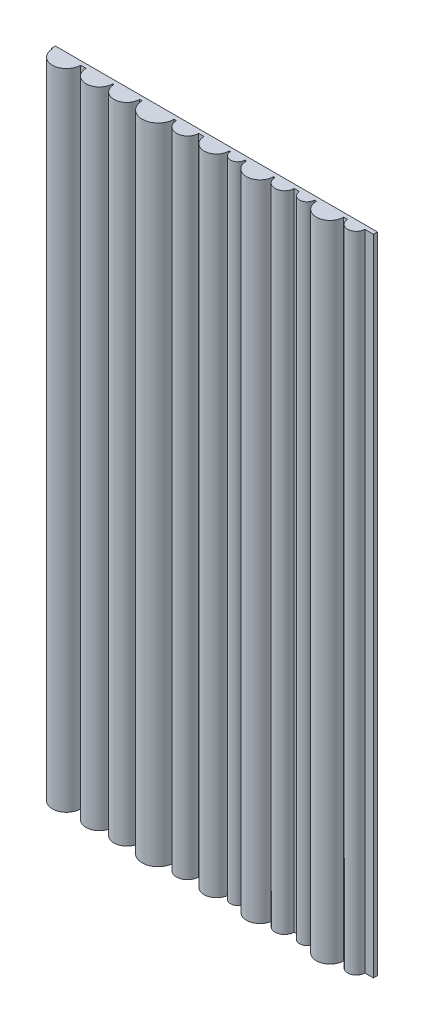
ISO-10303-21;
HEADER;
FILE_DESCRIPTION(('STEP AP214'),'2;1');
FILE_NAME('part.step','',(''),(''),'','','');
FILE_SCHEMA(('AUTOMOTIVE_DESIGN { 1 0 10303 214 1 1 1 1 }'));
ENDSEC;
DATA;
#1=APPLICATION_CONTEXT('core data for automotive mechanical design processes');
#2=APPLICATION_PROTOCOL_DEFINITION('international standard','automotive_design',2000,#1);
#3=PRODUCT_CONTEXT('',#1,'mechanical');
#4=PRODUCT('Part','Part','',(#3));
#5=PRODUCT_RELATED_PRODUCT_CATEGORY('part','',(#4));
#6=PRODUCT_DEFINITION_FORMATION('','',#4);
#7=PRODUCT_DEFINITION_CONTEXT('part definition',#1,'design');
#8=PRODUCT_DEFINITION('design','',#6,#7);
#9=PRODUCT_DEFINITION_SHAPE('','',#8);
#10=(LENGTH_UNIT() NAMED_UNIT(*) SI_UNIT(.MILLI.,.METRE.));
#11=(NAMED_UNIT(*) PLANE_ANGLE_UNIT() SI_UNIT($,.RADIAN.));
#12=(NAMED_UNIT(*) SI_UNIT($,.STERADIAN.) SOLID_ANGLE_UNIT());
#13=UNCERTAINTY_MEASURE_WITH_UNIT(LENGTH_MEASURE(1.E-05),#10,'distance_accuracy_value','');
#14=(GEOMETRIC_REPRESENTATION_CONTEXT(3) GLOBAL_UNCERTAINTY_ASSIGNED_CONTEXT((#13)) GLOBAL_UNIT_ASSIGNED_CONTEXT((#10,
#11,#12)) REPRESENTATION_CONTEXT('',''));
#15=CARTESIAN_POINT('',(0.,0.,0.));
#16=DIRECTION('',(0.,0.,1.));
#17=DIRECTION('',(1.,0.,0.));
#18=AXIS2_PLACEMENT_3D('',#15,#16,#17);
#19=CARTESIAN_POINT('',(0.,0.,0.1));
#20=DIRECTION('',(0.,0.,-1.));
#21=DIRECTION('',(-1.,0.,0.));
#22=AXIS2_PLACEMENT_3D('',#19,#20,#21);
#23=PLANE('',#22);
#24=DIRECTION('',(-1.,0.,0.));
#25=VECTOR('',#24,1.);
#26=CARTESIAN_POINT('',(0.,16.,0.1));
#27=LINE('',#26,#25);
#28=CARTESIAN_POINT('',(7.35997289214218,16.,0.1));
#29=VERTEX_POINT('',#28);
#30=CARTESIAN_POINT('',(7.26247222516436,16.,0.1));
#31=VERTEX_POINT('',#30);
#32=EDGE_CURVE('E233',#29,#31,#27,.T.);
#33=ORIENTED_EDGE('',*,*,#32,.T.);
#34=DIRECTION('',(0.,-1.,0.));
#35=VECTOR('',#34,1.);
#36=CARTESIAN_POINT('',(7.26247222516436,17.1228638474105,0.1));
#37=LINE('',#36,#35);
#38=CARTESIAN_POINT('',(7.26247222516436,0.,0.1));
#39=VERTEX_POINT('',#38);
#40=EDGE_CURVE('E54',#31,#39,#37,.T.);
#41=ORIENTED_EDGE('',*,*,#40,.T.);
#42=DIRECTION('',(1.,0.,0.));
#43=VECTOR('',#42,1.);
#44=CARTESIAN_POINT('',(0.,0.,0.1));
#45=LINE('',#44,#43);
#46=CARTESIAN_POINT('',(7.35997289214218,0.,0.1));
#47=VERTEX_POINT('',#46);
#48=EDGE_CURVE('E429',#39,#47,#45,.T.);
#49=ORIENTED_EDGE('',*,*,#48,.T.);
#50=DIRECTION('',(0.,-1.,0.));
#51=VECTOR('',#50,1.);
#52=CARTESIAN_POINT('',(7.35997289214218,17.1228638474105,0.1));
#53=LINE('',#52,#51);
#54=EDGE_CURVE('E292',#47,#29,#53,.F.);
#55=ORIENTED_EDGE('',*,*,#54,.T.);
#56=EDGE_LOOP('',(#33,#41,#49,#55));
#57=FACE_BOUND('',#56,.T.);
#58=ADVANCED_FACE('F38',(#57),#23,.F.);
#59=CARTESIAN_POINT('',(4.8464544478282,16.,0.1));
#60=VERTEX_POINT('',#59);
#61=CARTESIAN_POINT('',(4.80727128094524,16.,0.1));
#62=VERTEX_POINT('',#61);
#63=EDGE_CURVE('E492',#60,#62,#27,.T.);
#64=ORIENTED_EDGE('',*,*,#63,.T.);
#65=DIRECTION('',(0.,-1.,0.));
#66=VECTOR('',#65,1.);
#67=CARTESIAN_POINT('',(4.80727128094524,17.1228638474105,0.1));
#68=LINE('',#67,#66);
#69=CARTESIAN_POINT('',(4.80727128094524,0.,0.1));
#70=VERTEX_POINT('',#69);
#71=EDGE_CURVE('E266',#62,#70,#68,.T.);
#72=ORIENTED_EDGE('',*,*,#71,.T.);
#73=CARTESIAN_POINT('',(4.8464544478282,0.,0.1));
#74=VERTEX_POINT('',#73);
#75=EDGE_CURVE('E519',#70,#74,#45,.T.);
#76=ORIENTED_EDGE('',*,*,#75,.T.);
#77=DIRECTION('',(0.,-1.,0.));
#78=VECTOR('',#77,1.);
#79=CARTESIAN_POINT('',(4.8464544478282,17.1228638474105,0.1));
#80=LINE('',#79,#78);
#81=EDGE_CURVE('E335',#74,#60,#80,.F.);
#82=ORIENTED_EDGE('',*,*,#81,.T.);
#83=EDGE_LOOP('',(#64,#72,#76,#82));
#84=FACE_BOUND('',#83,.T.);
#85=ADVANCED_FACE('F560',(#84),#23,.F.);
#86=CARTESIAN_POINT('',(3.10842070374217,16.,0.1));
#87=VERTEX_POINT('',#86);
#88=CARTESIAN_POINT('',(3.04865491534628,16.,0.1));
#89=VERTEX_POINT('',#88);
#90=EDGE_CURVE('E483',#87,#89,#27,.T.);
#91=ORIENTED_EDGE('',*,*,#90,.T.);
#92=DIRECTION('',(0.,-1.,0.));
#93=VECTOR('',#92,1.);
#94=CARTESIAN_POINT('',(3.04865491534628,17.1228638474105,0.1));
#95=LINE('',#94,#93);
#96=CARTESIAN_POINT('',(3.04865491534628,0.,0.1));
#97=VERTEX_POINT('',#96);
#98=EDGE_CURVE('E281',#89,#97,#95,.T.);
#99=ORIENTED_EDGE('',*,*,#98,.T.);
#100=CARTESIAN_POINT('',(3.10842070374217,0.,0.1));
#101=VERTEX_POINT('',#100);
#102=EDGE_CURVE('E517',#97,#101,#45,.T.);
#103=ORIENTED_EDGE('',*,*,#102,.T.);
#104=DIRECTION('',(0.,-1.,0.));
#105=VECTOR('',#104,1.);
#106=CARTESIAN_POINT('',(3.10842070374217,17.1228638474105,0.1));
#107=LINE('',#106,#105);
#108=EDGE_CURVE('E365',#101,#87,#107,.F.);
#109=ORIENTED_EDGE('',*,*,#108,.T.);
#110=EDGE_LOOP('',(#91,#99,#103,#109));
#111=FACE_BOUND('',#110,.T.);
#112=ADVANCED_FACE('F565',(#111),#23,.F.);
#113=CARTESIAN_POINT('',(8.,16.,0.1));
#114=VERTEX_POINT('',#113);
#115=CARTESIAN_POINT('',(7.78590783886302,16.,0.1));
#116=VERTEX_POINT('',#115);
#117=EDGE_CURVE('E237',#114,#116,#27,.T.);
#118=ORIENTED_EDGE('',*,*,#117,.T.);
#119=DIRECTION('',(0.,-1.,0.));
#120=VECTOR('',#119,1.);
#121=CARTESIAN_POINT('',(7.78590783886302,17.1228638474105,0.1));
#122=LINE('',#121,#120);
#123=CARTESIAN_POINT('',(7.78590783886302,0.,0.1));
#124=VERTEX_POINT('',#123);
#125=EDGE_CURVE('E296',#116,#124,#122,.T.);
#126=ORIENTED_EDGE('',*,*,#125,.T.);
#127=CARTESIAN_POINT('',(8.,0.,0.1));
#128=VERTEX_POINT('',#127);
#129=EDGE_CURVE('E422',#124,#128,#45,.T.);
#130=ORIENTED_EDGE('',*,*,#129,.T.);
#131=DIRECTION('',(0.,1.,0.));
#132=VECTOR('',#131,1.);
#133=CARTESIAN_POINT('',(8.,0.,0.1));
#134=LINE('',#133,#132);
#135=EDGE_CURVE('E427',#128,#114,#134,.T.);
#136=ORIENTED_EDGE('',*,*,#135,.T.);
#137=EDGE_LOOP('',(#118,#126,#130,#136));
#138=FACE_BOUND('',#137,.T.);
#139=ADVANCED_FACE('F514',(#138),#23,.F.);
#140=CARTESIAN_POINT('',(6.52903295962137,0.,0.1));
#141=VERTEX_POINT('',#140);
#142=CARTESIAN_POINT('',(6.58191355824866,0.,0.1));
#143=VERTEX_POINT('',#142);
#144=EDGE_CURVE('E62',#141,#143,#45,.T.);
#145=ORIENTED_EDGE('',*,*,#144,.T.);
#146=DIRECTION('',(0.,-1.,0.));
#147=VECTOR('',#146,1.);
#148=CARTESIAN_POINT('',(6.58191355824866,17.1228638474105,0.1));
#149=LINE('',#148,#147);
#150=CARTESIAN_POINT('',(6.58191355824866,16.,0.1));
#151=VERTEX_POINT('',#150);
#152=EDGE_CURVE('E238',#143,#151,#149,.F.);
#153=ORIENTED_EDGE('',*,*,#152,.T.);
#154=CARTESIAN_POINT('',(6.52903295962137,16.,0.1));
#155=VERTEX_POINT('',#154);
#156=EDGE_CURVE('E225',#151,#155,#27,.T.);
#157=ORIENTED_EDGE('',*,*,#156,.T.);
#158=DIRECTION('',(0.,-1.,0.));
#159=VECTOR('',#158,1.);
#160=CARTESIAN_POINT('',(6.52903295962137,17.1228638474105,0.1));
#161=LINE('',#160,#159);
#162=EDGE_CURVE('E309',#155,#141,#161,.T.);
#163=ORIENTED_EDGE('',*,*,#162,.T.);
#164=EDGE_LOOP('',(#145,#153,#157,#163));
#165=FACE_BOUND('',#164,.T.);
#166=ADVANCED_FACE('F239',(#165),#23,.F.);
#167=CARTESIAN_POINT('',(6.03080442499624,0.,0.1));
#168=VERTEX_POINT('',#167);
#169=CARTESIAN_POINT('',(6.16298750561107,0.,0.1));
#170=VERTEX_POINT('',#169);
#171=EDGE_CURVE('E521',#168,#170,#45,.T.);
#172=ORIENTED_EDGE('',*,*,#171,.T.);
#173=DIRECTION('',(0.,-1.,0.));
#174=VECTOR('',#173,1.);
#175=CARTESIAN_POINT('',(6.16298750561107,17.1228638474105,0.1));
#176=LINE('',#175,#174);
#177=CARTESIAN_POINT('',(6.16298750561107,16.,0.1));
#178=VERTEX_POINT('',#177);
#179=EDGE_CURVE('E305',#170,#178,#176,.F.);
#180=ORIENTED_EDGE('',*,*,#179,.T.);
#181=CARTESIAN_POINT('',(6.03080442499624,16.,0.1));
#182=VERTEX_POINT('',#181);
#183=EDGE_CURVE('E234',#178,#182,#27,.T.);
#184=ORIENTED_EDGE('',*,*,#183,.T.);
#185=DIRECTION('',(0.,-1.,0.));
#186=VECTOR('',#185,1.);
#187=CARTESIAN_POINT('',(6.03080442499624,17.1228638474105,0.1));
#188=LINE('',#187,#186);
#189=EDGE_CURVE('E324',#182,#168,#188,.T.);
#190=ORIENTED_EDGE('',*,*,#189,.T.);
#191=EDGE_LOOP('',(#172,#180,#184,#190));
#192=FACE_BOUND('',#191,.T.);
#193=ADVANCED_FACE('F542',(#192),#23,.F.);
#194=CARTESIAN_POINT('',(5.52049952248696,0.,0.1));
#195=VERTEX_POINT('',#194);
#196=CARTESIAN_POINT('',(5.55630105868659,0.,0.1));
#197=VERTEX_POINT('',#196);
#198=EDGE_CURVE('E532',#195,#197,#45,.T.);
#199=ORIENTED_EDGE('',*,*,#198,.T.);
#200=DIRECTION('',(0.,-1.,0.));
#201=VECTOR('',#200,1.);
#202=CARTESIAN_POINT('',(5.55630105868659,17.1228638474105,0.1));
#203=LINE('',#202,#201);
#204=CARTESIAN_POINT('',(5.55630105868659,16.,0.1));
#205=VERTEX_POINT('',#204);
#206=EDGE_CURVE('E320',#197,#205,#203,.F.);
#207=ORIENTED_EDGE('',*,*,#206,.T.);
#208=CARTESIAN_POINT('',(5.52049952248696,16.,0.1));
#209=VERTEX_POINT('',#208);
#210=EDGE_CURVE('E497',#205,#209,#27,.T.);
#211=ORIENTED_EDGE('',*,*,#210,.T.);
#212=DIRECTION('',(0.,-1.,0.));
#213=VECTOR('',#212,1.);
#214=CARTESIAN_POINT('',(5.52049952248696,17.1228638474105,0.1));
#215=LINE('',#214,#213);
#216=EDGE_CURVE('E339',#209,#195,#215,.T.);
#217=ORIENTED_EDGE('',*,*,#216,.T.);
#218=EDGE_LOOP('',(#199,#207,#211,#217));
#219=FACE_BOUND('',#218,.T.);
#220=ADVANCED_FACE('F626',(#219),#23,.F.);
#221=CARTESIAN_POINT('',(4.41749297954344,0.,0.1));
#222=VERTEX_POINT('',#221);
#223=CARTESIAN_POINT('',(4.44798908830161,0.,0.1));
#224=VERTEX_POINT('',#223);
#225=EDGE_CURVE('E530',#222,#224,#45,.T.);
#226=ORIENTED_EDGE('',*,*,#225,.T.);
#227=DIRECTION('',(0.,-1.,0.));
#228=VECTOR('',#227,1.);
#229=CARTESIAN_POINT('',(4.44798908830161,17.1228638474105,0.1));
#230=LINE('',#229,#228);
#231=CARTESIAN_POINT('',(4.44798908830161,16.,0.1));
#232=VERTEX_POINT('',#231);
#233=EDGE_CURVE('E262',#224,#232,#230,.F.);
#234=ORIENTED_EDGE('',*,*,#233,.T.);
#235=CARTESIAN_POINT('',(4.41749297954344,16.,0.1));
#236=VERTEX_POINT('',#235);
#237=EDGE_CURVE('E236',#232,#236,#27,.T.);
#238=ORIENTED_EDGE('',*,*,#237,.T.);
#239=DIRECTION('',(0.,-1.,0.));
#240=VECTOR('',#239,1.);
#241=CARTESIAN_POINT('',(4.41749297954344,17.1228638474105,0.1));
#242=LINE('',#241,#240);
#243=EDGE_CURVE('E354',#236,#222,#242,.T.);
#244=ORIENTED_EDGE('',*,*,#243,.T.);
#245=EDGE_LOOP('',(#226,#234,#238,#244));
#246=FACE_BOUND('',#245,.T.);
#247=ADVANCED_FACE('F628',(#246),#23,.F.);
#248=CARTESIAN_POINT('',(3.65908630213837,0.,0.1));
#249=VERTEX_POINT('',#248);
#250=CARTESIAN_POINT('',(3.79385998382218,0.,0.1));
#251=VERTEX_POINT('',#250);
#252=EDGE_CURVE('E524',#249,#251,#45,.T.);
#253=ORIENTED_EDGE('',*,*,#252,.T.);
#254=DIRECTION('',(0.,-1.,0.));
#255=VECTOR('',#254,1.);
#256=CARTESIAN_POINT('',(3.79385998382218,17.1228638474105,0.1));
#257=LINE('',#256,#255);
#258=CARTESIAN_POINT('',(3.79385998382218,16.,0.1));
#259=VERTEX_POINT('',#258);
#260=EDGE_CURVE('E350',#251,#259,#257,.F.);
#261=ORIENTED_EDGE('',*,*,#260,.T.);
#262=CARTESIAN_POINT('',(3.65908630213837,16.,0.1));
#263=VERTEX_POINT('',#262);
#264=EDGE_CURVE('E488',#259,#263,#27,.T.);
#265=ORIENTED_EDGE('',*,*,#264,.T.);
#266=DIRECTION('',(0.,-1.,0.));
#267=VECTOR('',#266,1.);
#268=CARTESIAN_POINT('',(3.65908630213837,17.1228638474105,0.1));
#269=LINE('',#268,#267);
#270=EDGE_CURVE('E369',#263,#249,#269,.T.);
#271=ORIENTED_EDGE('',*,*,#270,.T.);
#272=EDGE_LOOP('',(#253,#261,#265,#271));
#273=FACE_BOUND('',#272,.T.);
#274=ADVANCED_FACE('F633',(#273),#23,.F.);
#275=CARTESIAN_POINT('',(2.19490448609716,0.,0.1));
#276=VERTEX_POINT('',#275);
#277=CARTESIAN_POINT('',(2.25467027449306,0.,0.1));
#278=VERTEX_POINT('',#277);
#279=EDGE_CURVE('E523',#276,#278,#45,.T.);
#280=ORIENTED_EDGE('',*,*,#279,.T.);
#281=DIRECTION('',(0.,-1.,0.));
#282=VECTOR('',#281,1.);
#283=CARTESIAN_POINT('',(2.25467027449306,17.1228638474105,0.1));
#284=LINE('',#283,#282);
#285=CARTESIAN_POINT('',(2.25467027449306,16.,0.1));
#286=VERTEX_POINT('',#285);
#287=EDGE_CURVE('E277',#278,#286,#284,.F.);
#288=ORIENTED_EDGE('',*,*,#287,.T.);
#289=CARTESIAN_POINT('',(2.19490448609716,16.,0.1));
#290=VERTEX_POINT('',#289);
#291=EDGE_CURVE('E482',#286,#290,#27,.T.);
#292=ORIENTED_EDGE('',*,*,#291,.T.);
#293=DIRECTION('',(0.,-1.,0.));
#294=VECTOR('',#293,1.);
#295=CARTESIAN_POINT('',(2.19490448609716,17.1228638474105,0.1));
#296=LINE('',#295,#294);
#297=EDGE_CURVE('E384',#290,#276,#296,.T.);
#298=ORIENTED_EDGE('',*,*,#297,.T.);
#299=EDGE_LOOP('',(#280,#288,#292,#298));
#300=FACE_BOUND('',#299,.T.);
#301=ADVANCED_FACE('F582',(#300),#23,.F.);
#302=CARTESIAN_POINT('',(1.52478365268645,0.,0.1));
#303=VERTEX_POINT('',#302);
#304=CARTESIAN_POINT('',(1.55480129349248,0.,0.1));
#305=VERTEX_POINT('',#304);
#306=EDGE_CURVE('E529',#303,#305,#45,.T.);
#307=ORIENTED_EDGE('',*,*,#306,.T.);
#308=DIRECTION('',(0.,-1.,0.));
#309=VECTOR('',#308,1.);
#310=CARTESIAN_POINT('',(1.55480129349248,17.1228638474105,0.1));
#311=LINE('',#310,#309);
#312=CARTESIAN_POINT('',(1.55480129349248,16.,0.1));
#313=VERTEX_POINT('',#312);
#314=EDGE_CURVE('E380',#305,#313,#311,.F.);
#315=ORIENTED_EDGE('',*,*,#314,.T.);
#316=CARTESIAN_POINT('',(1.52478365268645,16.,0.1));
#317=VERTEX_POINT('',#316);
#318=EDGE_CURVE('E478',#313,#317,#27,.T.);
#319=ORIENTED_EDGE('',*,*,#318,.T.);
#320=DIRECTION('',(0.,-1.,0.));
#321=VECTOR('',#320,1.);
#322=CARTESIAN_POINT('',(1.52478365268645,17.1228638474105,0.1));
#323=LINE('',#322,#321);
#324=EDGE_CURVE('E399',#317,#303,#323,.T.);
#325=ORIENTED_EDGE('',*,*,#324,.T.);
#326=EDGE_LOOP('',(#307,#315,#319,#325));
#327=FACE_BOUND('',#326,.T.);
#328=ADVANCED_FACE('F577',(#327),#23,.F.);
#329=CARTESIAN_POINT('',(0.726251270127603,0.,0.1));
#330=VERTEX_POINT('',#329);
#331=CARTESIAN_POINT('',(0.85988157762277,0.,0.1));
#332=VERTEX_POINT('',#331);
#333=EDGE_CURVE('E428',#330,#332,#45,.T.);
#334=ORIENTED_EDGE('',*,*,#333,.T.);
#335=DIRECTION('',(0.,-1.,0.));
#336=VECTOR('',#335,1.);
#337=CARTESIAN_POINT('',(0.85988157762277,17.1228638474105,0.1));
#338=LINE('',#337,#336);
#339=CARTESIAN_POINT('',(0.85988157762277,16.,0.1));
#340=VERTEX_POINT('',#339);
#341=EDGE_CURVE('E395',#332,#340,#338,.F.);
#342=ORIENTED_EDGE('',*,*,#341,.T.);
#343=CARTESIAN_POINT('',(0.726251270127603,16.,0.1));
#344=VERTEX_POINT('',#343);
#345=EDGE_CURVE('E476',#340,#344,#27,.T.);
#346=ORIENTED_EDGE('',*,*,#345,.T.);
#347=DIRECTION('',(0.,-1.,0.));
#348=VECTOR('',#347,1.);
#349=CARTESIAN_POINT('',(0.726251270127603,17.1228638474105,0.1));
#350=LINE('',#349,#348);
#351=EDGE_CURVE('E414',#344,#330,#350,.T.);
#352=ORIENTED_EDGE('',*,*,#351,.T.);
#353=EDGE_LOOP('',(#334,#342,#346,#352));
#354=FACE_BOUND('',#353,.T.);
#355=ADVANCED_FACE('F569',(#354),#23,.F.);
#356=CARTESIAN_POINT('',(0.,0.,0.1));
#357=DIRECTION('',(1.,0.,0.));
#358=DIRECTION('',(0.,0.,-1.));
#359=AXIS2_PLACEMENT_3D('',#356,#357,#358);
#360=PLANE('',#359);
#361=DIRECTION('',(0.,-1.,0.));
#362=VECTOR('',#361,1.);
#363=CARTESIAN_POINT('',(0.,0.,0.));
#364=LINE('',#363,#362);
#365=CARTESIAN_POINT('',(0.,16.,0.));
#366=VERTEX_POINT('',#365);
#367=CARTESIAN_POINT('',(0.,0.,0.));
#368=VERTEX_POINT('',#367);
#369=EDGE_CURVE('E417',#366,#368,#364,.T.);
#370=ORIENTED_EDGE('',*,*,#369,.T.);
#371=DIRECTION('',(0.,0.,-1.));
#372=VECTOR('',#371,1.);
#373=CARTESIAN_POINT('',(0.,0.,0.1));
#374=LINE('',#373,#372);
#375=CARTESIAN_POINT('',(0.,0.,0.1));
#376=VERTEX_POINT('',#375);
#377=EDGE_CURVE('E11',#376,#368,#374,.T.);
#378=ORIENTED_EDGE('',*,*,#377,.F.);
#379=DIRECTION('',(0.,-1.,0.));
#380=VECTOR('',#379,1.);
#381=CARTESIAN_POINT('',(0.,0.,0.1));
#382=LINE('',#381,#380);
#383=CARTESIAN_POINT('',(0.,16.,0.1));
#384=VERTEX_POINT('',#383);
#385=EDGE_CURVE('E418',#384,#376,#382,.T.);
#386=ORIENTED_EDGE('',*,*,#385,.F.);
#387=DIRECTION('',(0.,0.,-1.));
#388=VECTOR('',#387,1.);
#389=CARTESIAN_POINT('',(0.,16.,0.1));
#390=LINE('',#389,#388);
#391=EDGE_CURVE('E434',#384,#366,#390,.T.);
#392=ORIENTED_EDGE('',*,*,#391,.T.);
#393=EDGE_LOOP('',(#370,#378,#386,#392));
#394=FACE_BOUND('',#393,.T.);
#395=ADVANCED_FACE('F40',(#394),#360,.F.);
#396=CARTESIAN_POINT('',(0.,0.,0.1));
#397=DIRECTION('',(0.,1.,0.));
#398=DIRECTION('',(0.,0.,1.));
#399=AXIS2_PLACEMENT_3D('',#396,#397,#398);
#400=PLANE('',#399);
#401=DIRECTION('',(1.,0.,0.));
#402=VECTOR('',#401,1.);
#403=CARTESIAN_POINT('',(0.,0.,0.));
#404=LINE('',#403,#402);
#405=CARTESIAN_POINT('',(8.,0.,0.));
#406=VERTEX_POINT('',#405);
#407=EDGE_CURVE('E438',#368,#406,#404,.T.);
#408=ORIENTED_EDGE('',*,*,#407,.T.);
#409=DIRECTION('',(0.,0.,-1.));
#410=VECTOR('',#409,1.);
#411=CARTESIAN_POINT('',(8.,0.,0.1));
#412=LINE('',#411,#410);
#413=EDGE_CURVE('E47',#128,#406,#412,.T.);
#414=ORIENTED_EDGE('',*,*,#413,.F.);
#415=ORIENTED_EDGE('',*,*,#129,.F.);
#416=CARTESIAN_POINT('',(7.5729403655026,0.,0.1));
#417=DIRECTION('',(0.,-1.,0.));
#418=DIRECTION('',(0.,0.,-1.));
#419=AXIS2_PLACEMENT_3D('',#416,#417,#418);
#420=CIRCLE('',#419,0.212967473360418);
#421=EDGE_CURVE('E284',#124,#47,#420,.T.);
#422=ORIENTED_EDGE('',*,*,#421,.T.);
#423=ORIENTED_EDGE('',*,*,#48,.F.);
#424=CARTESIAN_POINT('',(6.92219289170651,0.,0.1));
#425=DIRECTION('',(0.,-1.,0.));
#426=DIRECTION('',(0.,0.,-1.));
#427=AXIS2_PLACEMENT_3D('',#424,#425,#426);
#428=CIRCLE('',#427,0.340279333457847);
#429=EDGE_CURVE('E247',#39,#143,#428,.T.);
#430=ORIENTED_EDGE('',*,*,#429,.T.);
#431=ORIENTED_EDGE('',*,*,#144,.F.);
#432=CARTESIAN_POINT('',(6.34601023261622,0.,0.1));
#433=DIRECTION('',(0.,-1.,0.));
#434=DIRECTION('',(0.,0.,-1.));
#435=AXIS2_PLACEMENT_3D('',#432,#433,#434);
#436=CIRCLE('',#435,0.18302272700515);
#437=EDGE_CURVE('E299',#141,#170,#436,.T.);
#438=ORIENTED_EDGE('',*,*,#437,.T.);
#439=ORIENTED_EDGE('',*,*,#171,.F.);
#440=CARTESIAN_POINT('',(5.79355274184142,0.,0.1));
#441=DIRECTION('',(0.,-1.,0.));
#442=DIRECTION('',(0.,0.,-1.));
#443=AXIS2_PLACEMENT_3D('',#440,#441,#442);
#444=CIRCLE('',#443,0.237251683154824);
#445=EDGE_CURVE('E312',#168,#197,#444,.T.);
#446=ORIENTED_EDGE('',*,*,#445,.T.);
#447=ORIENTED_EDGE('',*,*,#198,.F.);
#448=CARTESIAN_POINT('',(5.18347698515758,0.,0.1));
#449=DIRECTION('',(0.,-1.,0.));
#450=DIRECTION('',(0.,0.,-1.));
#451=AXIS2_PLACEMENT_3D('',#448,#449,#450);
#452=CIRCLE('',#451,0.337022537329384);
#453=EDGE_CURVE('E327',#195,#74,#452,.T.);
#454=ORIENTED_EDGE('',*,*,#453,.T.);
#455=ORIENTED_EDGE('',*,*,#75,.F.);
#456=CARTESIAN_POINT('',(4.62763018462342,0.,0.1));
#457=DIRECTION('',(0.,-1.,0.));
#458=DIRECTION('',(0.,0.,-1.));
#459=AXIS2_PLACEMENT_3D('',#456,#457,#458);
#460=CIRCLE('',#459,0.179641096321815);
#461=EDGE_CURVE('E254',#70,#224,#460,.T.);
#462=ORIENTED_EDGE('',*,*,#461,.T.);
#463=ORIENTED_EDGE('',*,*,#225,.F.);
#464=CARTESIAN_POINT('',(4.10567648168281,0.,0.1));
#465=DIRECTION('',(0.,-1.,0.));
#466=DIRECTION('',(0.,0.,-1.));
#467=AXIS2_PLACEMENT_3D('',#464,#465,#466);
#468=CIRCLE('',#467,0.311816497860627);
#469=EDGE_CURVE('E342',#222,#251,#468,.T.);
#470=ORIENTED_EDGE('',*,*,#469,.T.);
#471=ORIENTED_EDGE('',*,*,#252,.F.);
#472=CARTESIAN_POINT('',(3.38375350294027,0.,0.1));
#473=DIRECTION('',(0.,-1.,0.));
#474=DIRECTION('',(0.,0.,-1.));
#475=AXIS2_PLACEMENT_3D('',#472,#473,#474);
#476=CIRCLE('',#475,0.275332799198097);
#477=EDGE_CURVE('E357',#249,#101,#476,.T.);
#478=ORIENTED_EDGE('',*,*,#477,.T.);
#479=ORIENTED_EDGE('',*,*,#102,.F.);
#480=CARTESIAN_POINT('',(2.65166259491967,0.,0.1));
#481=DIRECTION('',(0.,-1.,0.));
#482=DIRECTION('',(0.,0.,-1.));
#483=AXIS2_PLACEMENT_3D('',#480,#481,#482);
#484=CIRCLE('',#483,0.396992320426608);
#485=EDGE_CURVE('E269',#97,#278,#484,.T.);
#486=ORIENTED_EDGE('',*,*,#485,.T.);
#487=ORIENTED_EDGE('',*,*,#279,.F.);
#488=CARTESIAN_POINT('',(1.87485288979482,0.,0.1));
#489=DIRECTION('',(0.,-1.,0.));
#490=DIRECTION('',(0.,0.,-1.));
#491=AXIS2_PLACEMENT_3D('',#488,#489,#490);
#492=CIRCLE('',#491,0.320051596302342);
#493=EDGE_CURVE('E372',#276,#305,#492,.T.);
#494=ORIENTED_EDGE('',*,*,#493,.T.);
#495=ORIENTED_EDGE('',*,*,#306,.F.);
#496=CARTESIAN_POINT('',(1.19233261515461,0.,0.1));
#497=DIRECTION('',(0.,-1.,0.));
#498=DIRECTION('',(0.,0.,-1.));
#499=AXIS2_PLACEMENT_3D('',#496,#497,#498);
#500=CIRCLE('',#499,0.332451037531842);
#501=EDGE_CURVE('E387',#303,#332,#500,.T.);
#502=ORIENTED_EDGE('',*,*,#501,.T.);
#503=ORIENTED_EDGE('',*,*,#333,.F.);
#504=CARTESIAN_POINT('',(0.375106214878597,0.,0.1));
#505=DIRECTION('',(0.,-1.,0.));
#506=DIRECTION('',(0.,0.,-1.));
#507=AXIS2_PLACEMENT_3D('',#504,#505,#506);
#508=CIRCLE('',#507,0.351145055249006);
#509=CARTESIAN_POINT('',(0.0239611596295905,0.,0.1));
#510=VERTEX_POINT('',#509);
#511=EDGE_CURVE('E402',#330,#510,#508,.T.);
#512=ORIENTED_EDGE('',*,*,#511,.T.);
#513=EDGE_CURVE('E424',#376,#510,#45,.T.);
#514=ORIENTED_EDGE('',*,*,#513,.F.);
#515=ORIENTED_EDGE('',*,*,#377,.T.);
#516=EDGE_LOOP('',(#408,#414,#415,#422,#423,#430,#431,#438,#439,#446,#447,#454,#455,#462,#463,
#470,#471,#478,#479,#486,#487,#494,#495,#502,#503,#512,#514,#515));
#517=FACE_BOUND('',#516,.T.);
#518=ADVANCED_FACE('F515',(#517),#400,.F.);
#519=CARTESIAN_POINT('',(8.,0.,0.1));
#520=DIRECTION('',(-1.,0.,0.));
#521=DIRECTION('',(0.,0.,1.));
#522=AXIS2_PLACEMENT_3D('',#519,#520,#521);
#523=PLANE('',#522);
#524=DIRECTION('',(0.,1.,0.));
#525=VECTOR('',#524,1.);
#526=CARTESIAN_POINT('',(8.,0.,0.));
#527=LINE('',#526,#525);
#528=CARTESIAN_POINT('',(8.,16.,0.));
#529=VERTEX_POINT('',#528);
#530=EDGE_CURVE('E441',#406,#529,#527,.T.);
#531=ORIENTED_EDGE('',*,*,#530,.T.);
#532=DIRECTION('',(0.,0.,-1.));
#533=VECTOR('',#532,1.);
#534=CARTESIAN_POINT('',(8.,16.,0.1));
#535=LINE('',#534,#533);
#536=EDGE_CURVE('E449',#114,#529,#535,.T.);
#537=ORIENTED_EDGE('',*,*,#536,.F.);
#538=ORIENTED_EDGE('',*,*,#135,.F.);
#539=ORIENTED_EDGE('',*,*,#413,.T.);
#540=EDGE_LOOP('',(#531,#537,#538,#539));
#541=FACE_BOUND('',#540,.T.);
#542=ADVANCED_FACE('F458',(#541),#523,.F.);
#543=CARTESIAN_POINT('',(0.,16.,0.1));
#544=DIRECTION('',(0.,-1.,0.));
#545=DIRECTION('',(0.,0.,-1.));
#546=AXIS2_PLACEMENT_3D('',#543,#544,#545);
#547=PLANE('',#546);
#548=DIRECTION('',(-1.,0.,0.));
#549=VECTOR('',#548,1.);
#550=CARTESIAN_POINT('',(0.,16.,0.));
#551=LINE('',#550,#549);
#552=EDGE_CURVE('E423',#529,#366,#551,.T.);
#553=ORIENTED_EDGE('',*,*,#552,.T.);
#554=ORIENTED_EDGE('',*,*,#391,.F.);
#555=CARTESIAN_POINT('',(0.0239611596295905,16.,0.1));
#556=VERTEX_POINT('',#555);
#557=EDGE_CURVE('E431',#556,#384,#27,.T.);
#558=ORIENTED_EDGE('',*,*,#557,.F.);
#559=CARTESIAN_POINT('',(0.375106214878597,16.,0.1));
#560=DIRECTION('',(0.,-1.,0.));
#561=DIRECTION('',(0.,0.,-1.));
#562=AXIS2_PLACEMENT_3D('',#559,#560,#561);
#563=CIRCLE('',#562,0.351145055249006);
#564=EDGE_CURVE('E406',#556,#344,#563,.F.);
#565=ORIENTED_EDGE('',*,*,#564,.T.);
#566=ORIENTED_EDGE('',*,*,#345,.F.);
#567=CARTESIAN_POINT('',(1.19233261515461,16.,0.1));
#568=DIRECTION('',(0.,-1.,0.));
#569=DIRECTION('',(0.,0.,-1.));
#570=AXIS2_PLACEMENT_3D('',#567,#568,#569);
#571=CIRCLE('',#570,0.332451037531842);
#572=EDGE_CURVE('E391',#340,#317,#571,.F.);
#573=ORIENTED_EDGE('',*,*,#572,.T.);
#574=ORIENTED_EDGE('',*,*,#318,.F.);
#575=CARTESIAN_POINT('',(1.87485288979482,16.,0.1));
#576=DIRECTION('',(0.,-1.,0.));
#577=DIRECTION('',(0.,0.,-1.));
#578=AXIS2_PLACEMENT_3D('',#575,#576,#577);
#579=CIRCLE('',#578,0.320051596302342);
#580=EDGE_CURVE('E376',#313,#290,#579,.F.);
#581=ORIENTED_EDGE('',*,*,#580,.T.);
#582=ORIENTED_EDGE('',*,*,#291,.F.);
#583=CARTESIAN_POINT('',(2.65166259491967,16.,0.1));
#584=DIRECTION('',(0.,-1.,0.));
#585=DIRECTION('',(0.,0.,-1.));
#586=AXIS2_PLACEMENT_3D('',#583,#584,#585);
#587=CIRCLE('',#586,0.396992320426608);
#588=EDGE_CURVE('E273',#286,#89,#587,.F.);
#589=ORIENTED_EDGE('',*,*,#588,.T.);
#590=ORIENTED_EDGE('',*,*,#90,.F.);
#591=CARTESIAN_POINT('',(3.38375350294027,16.,0.1));
#592=DIRECTION('',(0.,-1.,0.));
#593=DIRECTION('',(0.,0.,-1.));
#594=AXIS2_PLACEMENT_3D('',#591,#592,#593);
#595=CIRCLE('',#594,0.275332799198097);
#596=EDGE_CURVE('E361',#87,#263,#595,.F.);
#597=ORIENTED_EDGE('',*,*,#596,.T.);
#598=ORIENTED_EDGE('',*,*,#264,.F.);
#599=CARTESIAN_POINT('',(4.10567648168281,16.,0.1));
#600=DIRECTION('',(0.,-1.,0.));
#601=DIRECTION('',(0.,0.,-1.));
#602=AXIS2_PLACEMENT_3D('',#599,#600,#601);
#603=CIRCLE('',#602,0.311816497860627);
#604=EDGE_CURVE('E346',#259,#236,#603,.F.);
#605=ORIENTED_EDGE('',*,*,#604,.T.);
#606=ORIENTED_EDGE('',*,*,#237,.F.);
#607=CARTESIAN_POINT('',(4.62763018462342,16.,0.1));
#608=DIRECTION('',(0.,-1.,0.));
#609=DIRECTION('',(0.,0.,-1.));
#610=AXIS2_PLACEMENT_3D('',#607,#608,#609);
#611=CIRCLE('',#610,0.179641096321815);
#612=EDGE_CURVE('E258',#232,#62,#611,.F.);
#613=ORIENTED_EDGE('',*,*,#612,.T.);
#614=ORIENTED_EDGE('',*,*,#63,.F.);
#615=CARTESIAN_POINT('',(5.18347698515758,16.,0.1));
#616=DIRECTION('',(0.,-1.,0.));
#617=DIRECTION('',(0.,0.,-1.));
#618=AXIS2_PLACEMENT_3D('',#615,#616,#617);
#619=CIRCLE('',#618,0.337022537329384);
#620=EDGE_CURVE('E331',#60,#209,#619,.F.);
#621=ORIENTED_EDGE('',*,*,#620,.T.);
#622=ORIENTED_EDGE('',*,*,#210,.F.);
#623=CARTESIAN_POINT('',(5.79355274184142,16.,0.1));
#624=DIRECTION('',(0.,-1.,0.));
#625=DIRECTION('',(0.,0.,-1.));
#626=AXIS2_PLACEMENT_3D('',#623,#624,#625);
#627=CIRCLE('',#626,0.237251683154824);
#628=EDGE_CURVE('E316',#205,#182,#627,.F.);
#629=ORIENTED_EDGE('',*,*,#628,.T.);
#630=ORIENTED_EDGE('',*,*,#183,.F.);
#631=CARTESIAN_POINT('',(6.34601023261622,16.,0.1));
#632=DIRECTION('',(0.,-1.,0.));
#633=DIRECTION('',(0.,0.,-1.));
#634=AXIS2_PLACEMENT_3D('',#631,#632,#633);
#635=CIRCLE('',#634,0.18302272700515);
#636=EDGE_CURVE('E230',#178,#155,#635,.F.);
#637=ORIENTED_EDGE('',*,*,#636,.T.);
#638=ORIENTED_EDGE('',*,*,#156,.F.);
#639=CARTESIAN_POINT('',(6.92219289170651,16.,0.1));
#640=DIRECTION('',(0.,-1.,0.));
#641=DIRECTION('',(0.,0.,-1.));
#642=AXIS2_PLACEMENT_3D('',#639,#640,#641);
#643=CIRCLE('',#642,0.340279333457847);
#644=EDGE_CURVE('E228',#151,#31,#643,.F.);
#645=ORIENTED_EDGE('',*,*,#644,.T.);
#646=ORIENTED_EDGE('',*,*,#32,.F.);
#647=CARTESIAN_POINT('',(7.5729403655026,16.,0.1));
#648=DIRECTION('',(0.,-1.,0.));
#649=DIRECTION('',(0.,0.,-1.));
#650=AXIS2_PLACEMENT_3D('',#647,#648,#649);
#651=CIRCLE('',#650,0.212967473360418);
#652=EDGE_CURVE('E288',#29,#116,#651,.F.);
#653=ORIENTED_EDGE('',*,*,#652,.T.);
#654=ORIENTED_EDGE('',*,*,#117,.F.);
#655=ORIENTED_EDGE('',*,*,#536,.T.);
#656=EDGE_LOOP('',(#553,#554,#558,#565,#566,#573,#574,#581,#582,#589,#590,#597,#598,#605,#606,
#613,#614,#621,#622,#629,#630,#637,#638,#645,#646,#653,#654,#655));
#657=FACE_BOUND('',#656,.T.);
#658=ADVANCED_FACE('F226',(#657),#547,.F.);
#659=ORIENTED_EDGE('',*,*,#513,.T.);
#660=DIRECTION('',(0.,-1.,0.));
#661=VECTOR('',#660,1.);
#662=CARTESIAN_POINT('',(0.0239611596295905,17.1228638474105,0.1));
#663=LINE('',#662,#661);
#664=EDGE_CURVE('E410',#510,#556,#663,.F.);
#665=ORIENTED_EDGE('',*,*,#664,.T.);
#666=ORIENTED_EDGE('',*,*,#557,.T.);
#667=ORIENTED_EDGE('',*,*,#385,.T.);
#668=EDGE_LOOP('',(#659,#665,#666,#667));
#669=FACE_BOUND('',#668,.T.);
#670=ADVANCED_FACE('F472',(#669),#23,.F.);
#671=CARTESIAN_POINT('',(0.,0.,0.));
#672=DIRECTION('',(0.,0.,-1.));
#673=DIRECTION('',(-1.,0.,0.));
#674=AXIS2_PLACEMENT_3D('',#671,#672,#673);
#675=PLANE('',#674);
#676=ORIENTED_EDGE('',*,*,#369,.F.);
#677=ORIENTED_EDGE('',*,*,#552,.F.);
#678=ORIENTED_EDGE('',*,*,#530,.F.);
#679=ORIENTED_EDGE('',*,*,#407,.F.);
#680=EDGE_LOOP('',(#676,#677,#678,#679));
#681=FACE_BOUND('',#680,.T.);
#682=ADVANCED_FACE('F465',(#681),#675,.T.);
#683=CARTESIAN_POINT('',(0.375106214878597,17.1228638474105,0.1));
#684=DIRECTION('',(0.,-1.,0.));
#685=DIRECTION('',(0.,0.,-1.));
#686=AXIS2_PLACEMENT_3D('',#683,#684,#685);
#687=CYLINDRICAL_SURFACE('',#686,0.351145055249006);
#688=ORIENTED_EDGE('',*,*,#351,.F.);
#689=ORIENTED_EDGE('',*,*,#564,.F.);
#690=ORIENTED_EDGE('',*,*,#664,.F.);
#691=ORIENTED_EDGE('',*,*,#511,.F.);
#692=EDGE_LOOP('',(#688,#689,#690,#691));
#693=FACE_BOUND('',#692,.T.);
#694=ADVANCED_FACE('F574',(#693),#687,.T.);
#695=CARTESIAN_POINT('',(1.19233261515461,17.1228638474105,0.1));
#696=DIRECTION('',(0.,-1.,0.));
#697=DIRECTION('',(0.,0.,-1.));
#698=AXIS2_PLACEMENT_3D('',#695,#696,#697);
#699=CYLINDRICAL_SURFACE('',#698,0.332451037531842);
#700=ORIENTED_EDGE('',*,*,#324,.F.);
#701=ORIENTED_EDGE('',*,*,#572,.F.);
#702=ORIENTED_EDGE('',*,*,#341,.F.);
#703=ORIENTED_EDGE('',*,*,#501,.F.);
#704=EDGE_LOOP('',(#700,#701,#702,#703));
#705=FACE_BOUND('',#704,.T.);
#706=ADVANCED_FACE('F590',(#705),#699,.T.);
#707=CARTESIAN_POINT('',(1.87485288979482,17.1228638474105,0.1));
#708=DIRECTION('',(0.,-1.,0.));
#709=DIRECTION('',(0.,0.,-1.));
#710=AXIS2_PLACEMENT_3D('',#707,#708,#709);
#711=CYLINDRICAL_SURFACE('',#710,0.320051596302342);
#712=ORIENTED_EDGE('',*,*,#297,.F.);
#713=ORIENTED_EDGE('',*,*,#580,.F.);
#714=ORIENTED_EDGE('',*,*,#314,.F.);
#715=ORIENTED_EDGE('',*,*,#493,.F.);
#716=EDGE_LOOP('',(#712,#713,#714,#715));
#717=FACE_BOUND('',#716,.T.);
#718=ADVANCED_FACE('F599',(#717),#711,.T.);
#719=CARTESIAN_POINT('',(3.38375350294027,17.1228638474105,0.1));
#720=DIRECTION('',(0.,-1.,0.));
#721=DIRECTION('',(0.,0.,-1.));
#722=AXIS2_PLACEMENT_3D('',#719,#720,#721);
#723=CYLINDRICAL_SURFACE('',#722,0.275332799198097);
#724=ORIENTED_EDGE('',*,*,#270,.F.);
#725=ORIENTED_EDGE('',*,*,#596,.F.);
#726=ORIENTED_EDGE('',*,*,#108,.F.);
#727=ORIENTED_EDGE('',*,*,#477,.F.);
#728=EDGE_LOOP('',(#724,#725,#726,#727));
#729=FACE_BOUND('',#728,.T.);
#730=ADVANCED_FACE('F609',(#729),#723,.T.);
#731=CARTESIAN_POINT('',(4.10567648168281,17.1228638474105,0.1));
#732=DIRECTION('',(0.,-1.,0.));
#733=DIRECTION('',(0.,0.,-1.));
#734=AXIS2_PLACEMENT_3D('',#731,#732,#733);
#735=CYLINDRICAL_SURFACE('',#734,0.311816497860627);
#736=ORIENTED_EDGE('',*,*,#243,.F.);
#737=ORIENTED_EDGE('',*,*,#604,.F.);
#738=ORIENTED_EDGE('',*,*,#260,.F.);
#739=ORIENTED_EDGE('',*,*,#469,.F.);
#740=EDGE_LOOP('',(#736,#737,#738,#739));
#741=FACE_BOUND('',#740,.T.);
#742=ADVANCED_FACE('F612',(#741),#735,.T.);
#743=CARTESIAN_POINT('',(5.18347698515758,17.1228638474105,0.1));
#744=DIRECTION('',(0.,-1.,0.));
#745=DIRECTION('',(0.,0.,-1.));
#746=AXIS2_PLACEMENT_3D('',#743,#744,#745);
#747=CYLINDRICAL_SURFACE('',#746,0.337022537329384);
#748=ORIENTED_EDGE('',*,*,#216,.F.);
#749=ORIENTED_EDGE('',*,*,#620,.F.);
#750=ORIENTED_EDGE('',*,*,#81,.F.);
#751=ORIENTED_EDGE('',*,*,#453,.F.);
#752=EDGE_LOOP('',(#748,#749,#750,#751));
#753=FACE_BOUND('',#752,.T.);
#754=ADVANCED_FACE('F556',(#753),#747,.T.);
#755=CARTESIAN_POINT('',(5.79355274184142,17.1228638474105,0.1));
#756=DIRECTION('',(0.,-1.,0.));
#757=DIRECTION('',(0.,0.,-1.));
#758=AXIS2_PLACEMENT_3D('',#755,#756,#757);
#759=CYLINDRICAL_SURFACE('',#758,0.237251683154824);
#760=ORIENTED_EDGE('',*,*,#189,.F.);
#761=ORIENTED_EDGE('',*,*,#628,.F.);
#762=ORIENTED_EDGE('',*,*,#206,.F.);
#763=ORIENTED_EDGE('',*,*,#445,.F.);
#764=EDGE_LOOP('',(#760,#761,#762,#763));
#765=FACE_BOUND('',#764,.T.);
#766=ADVANCED_FACE('F548',(#765),#759,.T.);
#767=CARTESIAN_POINT('',(6.34601023261622,17.1228638474105,0.1));
#768=DIRECTION('',(0.,-1.,0.));
#769=DIRECTION('',(0.,0.,-1.));
#770=AXIS2_PLACEMENT_3D('',#767,#768,#769);
#771=CYLINDRICAL_SURFACE('',#770,0.18302272700515);
#772=ORIENTED_EDGE('',*,*,#162,.F.);
#773=ORIENTED_EDGE('',*,*,#636,.F.);
#774=ORIENTED_EDGE('',*,*,#179,.F.);
#775=ORIENTED_EDGE('',*,*,#437,.F.);
#776=EDGE_LOOP('',(#772,#773,#774,#775));
#777=FACE_BOUND('',#776,.T.);
#778=ADVANCED_FACE('F546',(#777),#771,.T.);
#779=CARTESIAN_POINT('',(7.5729403655026,17.1228638474105,0.1));
#780=DIRECTION('',(0.,-1.,0.));
#781=DIRECTION('',(0.,0.,-1.));
#782=AXIS2_PLACEMENT_3D('',#779,#780,#781);
#783=CYLINDRICAL_SURFACE('',#782,0.212967473360418);
#784=ORIENTED_EDGE('',*,*,#125,.F.);
#785=ORIENTED_EDGE('',*,*,#652,.F.);
#786=ORIENTED_EDGE('',*,*,#54,.F.);
#787=ORIENTED_EDGE('',*,*,#421,.F.);
#788=EDGE_LOOP('',(#784,#785,#786,#787));
#789=FACE_BOUND('',#788,.T.);
#790=ADVANCED_FACE('F511',(#789),#783,.T.);
#791=CARTESIAN_POINT('',(2.65166259491967,17.1228638474105,0.1));
#792=DIRECTION('',(0.,-1.,0.));
#793=DIRECTION('',(0.,0.,-1.));
#794=AXIS2_PLACEMENT_3D('',#791,#792,#793);
#795=CYLINDRICAL_SURFACE('',#794,0.396992320426608);
#796=ORIENTED_EDGE('',*,*,#98,.F.);
#797=ORIENTED_EDGE('',*,*,#588,.F.);
#798=ORIENTED_EDGE('',*,*,#287,.F.);
#799=ORIENTED_EDGE('',*,*,#485,.F.);
#800=EDGE_LOOP('',(#796,#797,#798,#799));
#801=FACE_BOUND('',#800,.T.);
#802=ADVANCED_FACE('F554',(#801),#795,.T.);
#803=CARTESIAN_POINT('',(4.62763018462342,17.1228638474105,0.1));
#804=DIRECTION('',(0.,-1.,0.));
#805=DIRECTION('',(0.,0.,-1.));
#806=AXIS2_PLACEMENT_3D('',#803,#804,#805);
#807=CYLINDRICAL_SURFACE('',#806,0.179641096321815);
#808=ORIENTED_EDGE('',*,*,#71,.F.);
#809=ORIENTED_EDGE('',*,*,#612,.F.);
#810=ORIENTED_EDGE('',*,*,#233,.F.);
#811=ORIENTED_EDGE('',*,*,#461,.F.);
#812=EDGE_LOOP('',(#808,#809,#810,#811));
#813=FACE_BOUND('',#812,.T.);
#814=ADVANCED_FACE('F711',(#813),#807,.T.);
#815=CARTESIAN_POINT('',(6.92219289170651,17.1228638474105,0.1));
#816=DIRECTION('',(0.,-1.,0.));
#817=DIRECTION('',(0.,0.,-1.));
#818=AXIS2_PLACEMENT_3D('',#815,#816,#817);
#819=CYLINDRICAL_SURFACE('',#818,0.340279333457847);
#820=ORIENTED_EDGE('',*,*,#40,.F.);
#821=ORIENTED_EDGE('',*,*,#644,.F.);
#822=ORIENTED_EDGE('',*,*,#152,.F.);
#823=ORIENTED_EDGE('',*,*,#429,.F.);
#824=EDGE_LOOP('',(#820,#821,#822,#823));
#825=FACE_BOUND('',#824,.T.);
#826=ADVANCED_FACE('F245',(#825),#819,.T.);
#827=CLOSED_SHELL('',(#58,#85,#112,#139,#166,#193,#220,#247,#274,#301,#328,#355,#395,#518,#542,
#658,#670,#682,#694,#706,#718,#730,#742,#754,#766,#778,#790,#802,#814,#826));
#828=MANIFOLD_SOLID_BREP('B2',#827);
#829=ADVANCED_BREP_SHAPE_REPRESENTATION('',(#18,#828),#14);
#830=SHAPE_DEFINITION_REPRESENTATION(#9,#829);
ENDSEC;
END-ISO-10303-21;
